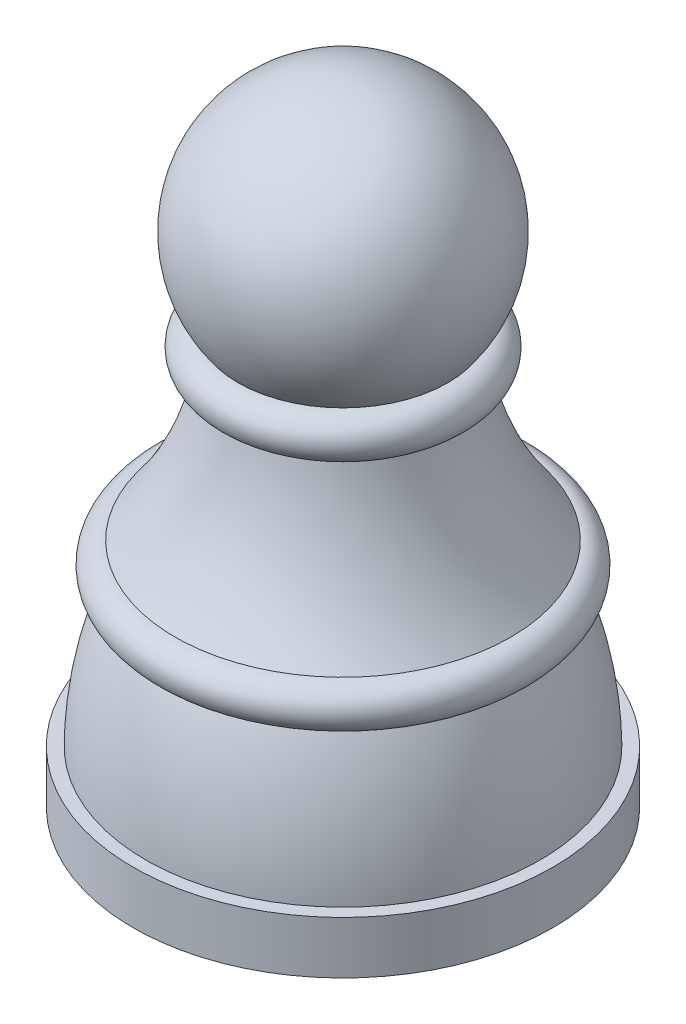
ISO-10303-21;
HEADER;
FILE_DESCRIPTION(('STEP AP214'),'2;1');
FILE_NAME('part.step','',(''),(''),'','','');
FILE_SCHEMA(('AUTOMOTIVE_DESIGN { 1 0 10303 214 1 1 1 1 }'));
ENDSEC;
DATA;
#1=APPLICATION_CONTEXT('core data for automotive mechanical design processes');
#2=APPLICATION_PROTOCOL_DEFINITION('international standard','automotive_design',2000,#1);
#3=PRODUCT_CONTEXT('',#1,'mechanical');
#4=PRODUCT('Part','Part','',(#3));
#5=PRODUCT_RELATED_PRODUCT_CATEGORY('part','',(#4));
#6=PRODUCT_DEFINITION_FORMATION('','',#4);
#7=PRODUCT_DEFINITION_CONTEXT('part definition',#1,'design');
#8=PRODUCT_DEFINITION('design','',#6,#7);
#9=PRODUCT_DEFINITION_SHAPE('','',#8);
#10=(LENGTH_UNIT() NAMED_UNIT(*) SI_UNIT(.MILLI.,.METRE.));
#11=(NAMED_UNIT(*) PLANE_ANGLE_UNIT() SI_UNIT($,.RADIAN.));
#12=(NAMED_UNIT(*) SI_UNIT($,.STERADIAN.) SOLID_ANGLE_UNIT());
#13=UNCERTAINTY_MEASURE_WITH_UNIT(LENGTH_MEASURE(1.E-05),#10,'distance_accuracy_value','');
#14=(GEOMETRIC_REPRESENTATION_CONTEXT(3) GLOBAL_UNCERTAINTY_ASSIGNED_CONTEXT((#13)) GLOBAL_UNIT_ASSIGNED_CONTEXT((#10,
#11,#12)) REPRESENTATION_CONTEXT('',''));
#15=CARTESIAN_POINT('',(0.,0.,0.));
#16=DIRECTION('',(0.,0.,1.));
#17=DIRECTION('',(1.,0.,0.));
#18=AXIS2_PLACEMENT_3D('',#15,#16,#17);
#19=CARTESIAN_POINT('',(0.,0.,0.));
#20=DIRECTION('',(0.,1.,0.));
#21=DIRECTION('',(-1.,0.,0.));
#22=AXIS2_PLACEMENT_3D('',#19,#20,#21);
#23=PLANE('',#22);
#24=CARTESIAN_POINT('',(0.,0.,0.));
#25=DIRECTION('',(0.,1.,0.));
#26=DIRECTION('',(-1.,0.,0.));
#27=AXIS2_PLACEMENT_3D('',#24,#25,#26);
#28=CIRCLE('',#27,12.7);
#29=CARTESIAN_POINT('',(-12.7,0.,0.));
#30=VERTEX_POINT('',#29);
#31=EDGE_CURVE('E10',#30,#30,#28,.T.);
#32=ORIENTED_EDGE('',*,*,#31,.F.);
#33=EDGE_LOOP('',(#32));
#34=FACE_BOUND('',#33,.T.);
#35=ADVANCED_FACE('F41',(#34),#23,.F.);
#36=CARTESIAN_POINT('',(0.,38.1,0.));
#37=DIRECTION('',(0.,1.,0.));
#38=DIRECTION('',(-1.,0.,0.));
#39=AXIS2_PLACEMENT_3D('',#36,#37,#38);
#40=CYLINDRICAL_SURFACE('',#39,12.7);
#41=CARTESIAN_POINT('',(0.,3.175,0.));
#42=DIRECTION('',(0.,1.,0.));
#43=DIRECTION('',(-1.,0.,0.));
#44=AXIS2_PLACEMENT_3D('',#41,#42,#43);
#45=CIRCLE('',#44,12.7);
#46=CARTESIAN_POINT('',(-12.7,3.175,0.));
#47=VERTEX_POINT('',#46);
#48=EDGE_CURVE('E47',#47,#47,#45,.T.);
#49=ORIENTED_EDGE('',*,*,#48,.F.);
#50=EDGE_LOOP('',(#49));
#51=FACE_BOUND('',#50,.T.);
#52=ORIENTED_EDGE('',*,*,#31,.T.);
#53=EDGE_LOOP('',(#52));
#54=FACE_BOUND('',#53,.T.);
#55=ADVANCED_FACE('F98',(#51,#54),#40,.T.);
#56=CARTESIAN_POINT('',(12.7,3.175,0.));
#57=DIRECTION('',(0.,-1.,0.));
#58=DIRECTION('',(1.,0.,0.));
#59=AXIS2_PLACEMENT_3D('',#56,#57,#58);
#60=PLANE('',#59);
#61=CARTESIAN_POINT('',(0.,3.175,0.));
#62=DIRECTION('',(0.,1.,0.));
#63=DIRECTION('',(-1.,0.,0.));
#64=AXIS2_PLACEMENT_3D('',#61,#62,#63);
#65=CIRCLE('',#64,11.938);
#66=CARTESIAN_POINT('',(-11.938,3.175,0.));
#67=VERTEX_POINT('',#66);
#68=EDGE_CURVE('E51',#67,#67,#65,.T.);
#69=ORIENTED_EDGE('',*,*,#68,.F.);
#70=EDGE_LOOP('',(#69));
#71=FACE_BOUND('',#70,.T.);
#72=ORIENTED_EDGE('',*,*,#48,.T.);
#73=EDGE_LOOP('',(#72));
#74=FACE_BOUND('',#73,.T.);
#75=ADVANCED_FACE('F93',(#71,#74),#60,.F.);
#76=CARTESIAN_POINT('',(0.,2.89121490622734,0.));
#77=DIRECTION('',(0.,1.,0.));
#78=DIRECTION('',(-1.,0.,0.));
#79=AXIS2_PLACEMENT_3D('',#76,#77,#78);
#80=DEGENERATE_TOROIDAL_SURFACE('',#79,9.43196650680163,21.3718507032328,.F.);
#81=CARTESIAN_POINT('',(0.,11.43,0.));
#82=DIRECTION('',(0.,1.,0.));
#83=DIRECTION('',(-1.,0.,0.));
#84=AXIS2_PLACEMENT_3D('',#81,#82,#83);
#85=CIRCLE('',#84,10.16);
#86=CARTESIAN_POINT('',(-10.16,11.43,0.));
#87=VERTEX_POINT('',#86);
#88=EDGE_CURVE('E55',#87,#87,#85,.T.);
#89=ORIENTED_EDGE('',*,*,#88,.F.);
#90=EDGE_LOOP('',(#89));
#91=FACE_BOUND('',#90,.T.);
#92=ORIENTED_EDGE('',*,*,#68,.T.);
#93=EDGE_LOOP('',(#92));
#94=FACE_BOUND('',#93,.T.);
#95=ADVANCED_FACE('F87',(#91,#94),#80,.F.);
#96=CARTESIAN_POINT('',(0.,12.7,0.));
#97=DIRECTION('',(0.,1.,0.));
#98=DIRECTION('',(-1.,0.,0.));
#99=AXIS2_PLACEMENT_3D('',#96,#97,#98);
#100=TOROIDAL_SURFACE('',#99,10.16,1.27);
#101=CARTESIAN_POINT('',(0.,13.97,0.));
#102=DIRECTION('',(0.,1.,0.));
#103=DIRECTION('',(-1.,0.,0.));
#104=AXIS2_PLACEMENT_3D('',#101,#102,#103);
#105=CIRCLE('',#104,10.16);
#106=CARTESIAN_POINT('',(-10.16,13.97,0.));
#107=VERTEX_POINT('',#106);
#108=EDGE_CURVE('E60',#107,#107,#105,.T.);
#109=ORIENTED_EDGE('',*,*,#108,.F.);
#110=EDGE_LOOP('',(#109));
#111=FACE_BOUND('',#110,.T.);
#112=ORIENTED_EDGE('',*,*,#88,.T.);
#113=EDGE_LOOP('',(#112));
#114=FACE_BOUND('',#113,.T.);
#115=ADVANCED_FACE('F81',(#111,#114),#100,.T.);
#116=CARTESIAN_POINT('',(0.,25.9296219456242,0.));
#117=DIRECTION('',(0.,1.,0.));
#118=DIRECTION('',(-1.,0.,0.));
#119=AXIS2_PLACEMENT_3D('',#116,#117,#118);
#120=TOROIDAL_SURFACE('',#119,25.7891178731232,19.6799868540158);
#121=CARTESIAN_POINT('',(0.,22.86,0.));
#122=DIRECTION('',(0.,1.,0.));
#123=DIRECTION('',(-1.,0.,0.));
#124=AXIS2_PLACEMENT_3D('',#121,#122,#123);
#125=CIRCLE('',#124,6.35);
#126=CARTESIAN_POINT('',(-6.35,22.86,0.));
#127=VERTEX_POINT('',#126);
#128=EDGE_CURVE('E63',#127,#127,#125,.T.);
#129=ORIENTED_EDGE('',*,*,#128,.F.);
#130=EDGE_LOOP('',(#129));
#131=FACE_BOUND('',#130,.T.);
#132=ORIENTED_EDGE('',*,*,#108,.T.);
#133=EDGE_LOOP('',(#132));
#134=FACE_BOUND('',#133,.T.);
#135=ADVANCED_FACE('F75',(#131,#134),#120,.F.);
#136=CARTESIAN_POINT('',(0.,24.13,0.));
#137=DIRECTION('',(0.,1.,0.));
#138=DIRECTION('',(-1.,0.,0.));
#139=AXIS2_PLACEMENT_3D('',#136,#137,#138);
#140=TOROIDAL_SURFACE('',#139,6.35,1.27);
#141=CARTESIAN_POINT('',(0.,25.4,0.));
#142=DIRECTION('',(0.,1.,0.));
#143=DIRECTION('',(-1.,0.,0.));
#144=AXIS2_PLACEMENT_3D('',#141,#142,#143);
#145=CIRCLE('',#144,6.35);
#146=CARTESIAN_POINT('',(-6.35,25.4,0.));
#147=VERTEX_POINT('',#146);
#148=EDGE_CURVE('E66',#147,#147,#145,.T.);
#149=ORIENTED_EDGE('',*,*,#148,.F.);
#150=EDGE_LOOP('',(#149));
#151=FACE_BOUND('',#150,.T.);
#152=ORIENTED_EDGE('',*,*,#128,.T.);
#153=EDGE_LOOP('',(#152));
#154=FACE_BOUND('',#153,.T.);
#155=ADVANCED_FACE('F72',(#151,#154),#140,.T.);
#156=CARTESIAN_POINT('',(0.,30.1625,0.));
#157=DIRECTION('',(0.,1.,0.));
#158=DIRECTION('',(1.,0.,0.));
#159=AXIS2_PLACEMENT_3D('',#156,#157,#158);
#160=SPHERICAL_SURFACE('',#159,7.9375);
#161=ORIENTED_EDGE('',*,*,#148,.T.);
#162=EDGE_LOOP('',(#161));
#163=FACE_BOUND('',#162,.T.);
#164=ADVANCED_FACE('F70',(#163),#160,.T.);
#165=CLOSED_SHELL('',(#35,#55,#75,#95,#115,#135,#155,#164));
#166=MANIFOLD_SOLID_BREP('B2',#165);
#167=ADVANCED_BREP_SHAPE_REPRESENTATION('',(#18,#166),#14);
#168=SHAPE_DEFINITION_REPRESENTATION(#9,#167);
ENDSEC;
END-ISO-10303-21;
